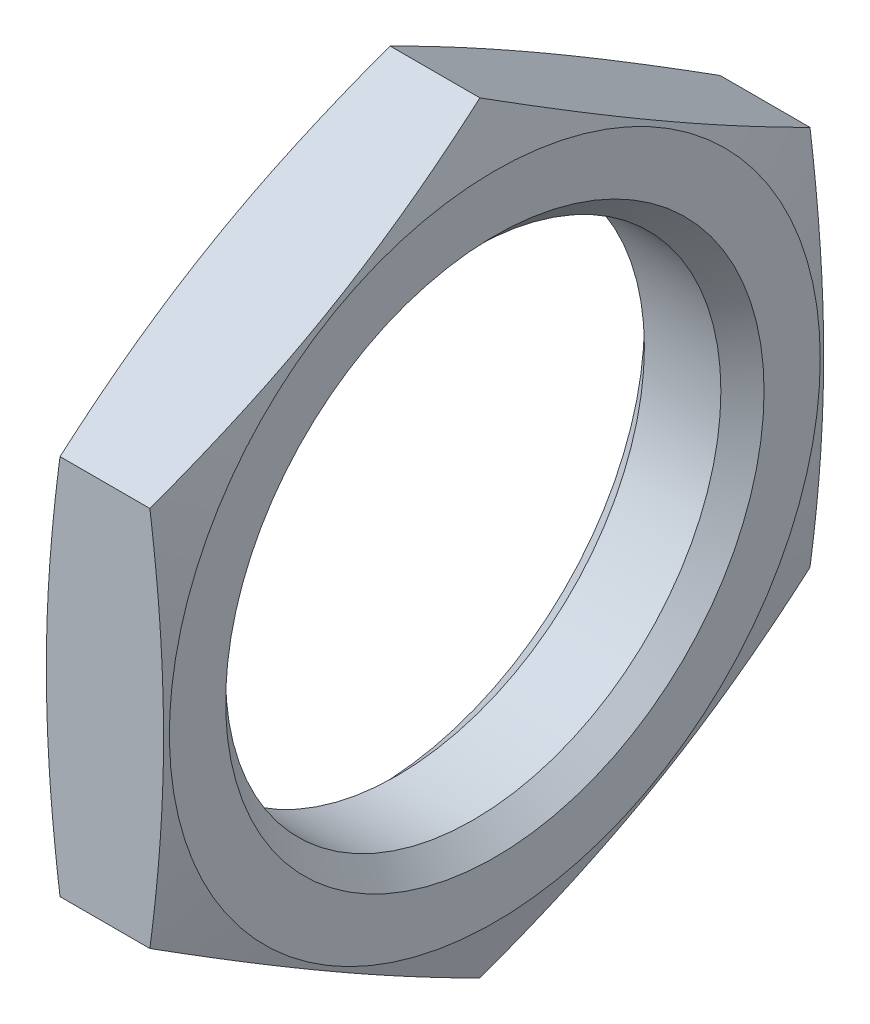
ISO-10303-21;
HEADER;
FILE_DESCRIPTION(('STEP AP214'),'2;1');
FILE_NAME('part.step','',(''),(''),'','','');
FILE_SCHEMA(('AUTOMOTIVE_DESIGN { 1 0 10303 214 1 1 1 1 }'));
ENDSEC;
DATA;
#1=APPLICATION_CONTEXT('core data for automotive mechanical design processes');
#2=APPLICATION_PROTOCOL_DEFINITION('international standard','automotive_design',2000,#1);
#3=PRODUCT_CONTEXT('',#1,'mechanical');
#4=PRODUCT('Part','Part','',(#3));
#5=PRODUCT_RELATED_PRODUCT_CATEGORY('part','',(#4));
#6=PRODUCT_DEFINITION_FORMATION('','',#4);
#7=PRODUCT_DEFINITION_CONTEXT('part definition',#1,'design');
#8=PRODUCT_DEFINITION('design','',#6,#7);
#9=PRODUCT_DEFINITION_SHAPE('','',#8);
#10=(LENGTH_UNIT() NAMED_UNIT(*) SI_UNIT(.MILLI.,.METRE.));
#11=(NAMED_UNIT(*) PLANE_ANGLE_UNIT() SI_UNIT($,.RADIAN.));
#12=(NAMED_UNIT(*) SI_UNIT($,.STERADIAN.) SOLID_ANGLE_UNIT());
#13=UNCERTAINTY_MEASURE_WITH_UNIT(LENGTH_MEASURE(1.E-05),#10,'distance_accuracy_value','');
#14=(GEOMETRIC_REPRESENTATION_CONTEXT(3) GLOBAL_UNCERTAINTY_ASSIGNED_CONTEXT((#13)) GLOBAL_UNIT_ASSIGNED_CONTEXT((#10,
#11,#12)) REPRESENTATION_CONTEXT('',''));
#15=CARTESIAN_POINT('',(0.,0.,0.));
#16=DIRECTION('',(0.,0.,1.));
#17=DIRECTION('',(1.,0.,0.));
#18=AXIS2_PLACEMENT_3D('',#15,#16,#17);
#19=CARTESIAN_POINT('',(-3.175,17.27,0.));
#20=DIRECTION('',(-1.,0.,0.));
#21=DIRECTION('',(0.,0.,1.));
#22=AXIS2_PLACEMENT_3D('',#19,#20,#21);
#23=PLANE('',#22);
#24=CARTESIAN_POINT('',(-3.175,0.,0.));
#25=DIRECTION('',(1.,0.,0.));
#26=DIRECTION('',(0.,0.,-1.));
#27=AXIS2_PLACEMENT_3D('',#24,#25,#26);
#28=CIRCLE('',#27,14.2875);
#29=CARTESIAN_POINT('',(-3.175,0.,-14.2875));
#30=VERTEX_POINT('',#29);
#31=EDGE_CURVE('E375',#30,#30,#28,.T.);
#32=ORIENTED_EDGE('',*,*,#31,.T.);
#33=EDGE_LOOP('',(#32));
#34=FACE_BOUND('',#33,.T.);
#35=CARTESIAN_POINT('',(-3.175,0.,0.));
#36=DIRECTION('',(1.,0.,0.));
#37=DIRECTION('',(0.,0.,-1.));
#38=AXIS2_PLACEMENT_3D('',#35,#36,#37);
#39=CIRCLE('',#38,17.27);
#40=CARTESIAN_POINT('',(-3.175,0.,-17.27));
#41=VERTEX_POINT('',#40);
#42=EDGE_CURVE('E366',#41,#41,#39,.T.);
#43=ORIENTED_EDGE('',*,*,#42,.F.);
#44=EDGE_LOOP('',(#43));
#45=FACE_BOUND('',#44,.T.);
#46=ADVANCED_FACE('F14',(#34,#45),#23,.T.);
#47=CARTESIAN_POINT('',(-3.175,0.,0.));
#48=DIRECTION('',(-1.,0.,0.));
#49=DIRECTION('',(0.,0.,1.));
#50=AXIS2_PLACEMENT_3D('',#47,#48,#49);
#51=CONICAL_SURFACE('',#50,14.2875,0.785398163397448);
#52=CARTESIAN_POINT('',(-2.02946,0.,0.));
#53=DIRECTION('',(1.,0.,0.));
#54=DIRECTION('',(0.,0.,-1.));
#55=AXIS2_PLACEMENT_3D('',#52,#53,#54);
#56=CIRCLE('',#55,13.14196);
#57=CARTESIAN_POINT('',(-2.02946,0.,-13.14196));
#58=VERTEX_POINT('',#57);
#59=EDGE_CURVE('E364',#58,#58,#56,.T.);
#60=ORIENTED_EDGE('',*,*,#59,.T.);
#61=EDGE_LOOP('',(#60));
#62=FACE_BOUND('',#61,.T.);
#63=ORIENTED_EDGE('',*,*,#31,.F.);
#64=EDGE_LOOP('',(#63));
#65=FACE_BOUND('',#64,.T.);
#66=ADVANCED_FACE('F334',(#62,#65),#51,.F.);
#67=CARTESIAN_POINT('',(3.175,0.,0.));
#68=DIRECTION('',(1.,0.,0.));
#69=DIRECTION('',(0.,0.,-1.));
#70=AXIS2_PLACEMENT_3D('',#67,#68,#69);
#71=CYLINDRICAL_SURFACE('',#70,13.14196);
#72=CARTESIAN_POINT('',(2.02946,0.,0.));
#73=DIRECTION('',(1.,0.,0.));
#74=DIRECTION('',(0.,0.,-1.));
#75=AXIS2_PLACEMENT_3D('',#72,#73,#74);
#76=CIRCLE('',#75,13.14196);
#77=CARTESIAN_POINT('',(2.02946,0.,-13.14196));
#78=VERTEX_POINT('',#77);
#79=EDGE_CURVE('E362',#78,#78,#76,.T.);
#80=ORIENTED_EDGE('',*,*,#79,.T.);
#81=EDGE_LOOP('',(#80));
#82=FACE_BOUND('',#81,.T.);
#83=ORIENTED_EDGE('',*,*,#59,.F.);
#84=EDGE_LOOP('',(#83));
#85=FACE_BOUND('',#84,.T.);
#86=ADVANCED_FACE('F341',(#82,#85),#71,.F.);
#87=CARTESIAN_POINT('',(2.02946,0.,0.));
#88=DIRECTION('',(1.,0.,0.));
#89=DIRECTION('',(0.,0.,-1.));
#90=AXIS2_PLACEMENT_3D('',#87,#88,#89);
#91=CONICAL_SURFACE('',#90,13.14196,0.785398163397449);
#92=CARTESIAN_POINT('',(3.175,0.,0.));
#93=DIRECTION('',(1.,0.,0.));
#94=DIRECTION('',(0.,0.,-1.));
#95=AXIS2_PLACEMENT_3D('',#92,#93,#94);
#96=CIRCLE('',#95,14.2875);
#97=CARTESIAN_POINT('',(3.175,0.,-14.2875));
#98=VERTEX_POINT('',#97);
#99=EDGE_CURVE('E356',#98,#98,#96,.T.);
#100=ORIENTED_EDGE('',*,*,#99,.T.);
#101=EDGE_LOOP('',(#100));
#102=FACE_BOUND('',#101,.T.);
#103=ORIENTED_EDGE('',*,*,#79,.F.);
#104=EDGE_LOOP('',(#103));
#105=FACE_BOUND('',#104,.T.);
#106=ADVANCED_FACE('F348',(#102,#105),#91,.F.);
#107=CARTESIAN_POINT('',(3.175,14.2875,0.));
#108=DIRECTION('',(1.,0.,0.));
#109=DIRECTION('',(0.,0.,-1.));
#110=AXIS2_PLACEMENT_3D('',#107,#108,#109);
#111=PLANE('',#110);
#112=CARTESIAN_POINT('',(3.175,0.,0.));
#113=DIRECTION('',(1.,0.,0.));
#114=DIRECTION('',(0.,0.,-1.));
#115=AXIS2_PLACEMENT_3D('',#112,#113,#114);
#116=CIRCLE('',#115,17.27);
#117=CARTESIAN_POINT('',(3.175,0.,-17.27));
#118=VERTEX_POINT('',#117);
#119=EDGE_CURVE('E100',#118,#118,#116,.T.);
#120=ORIENTED_EDGE('',*,*,#119,.T.);
#121=EDGE_LOOP('',(#120));
#122=FACE_BOUND('',#121,.T.);
#123=ORIENTED_EDGE('',*,*,#99,.F.);
#124=EDGE_LOOP('',(#123));
#125=FACE_BOUND('',#124,.T.);
#126=ADVANCED_FACE('F114',(#122,#125),#111,.T.);
#127=CARTESIAN_POINT('',(3.175,0.,0.));
#128=DIRECTION('',(-1.,0.,0.));
#129=DIRECTION('',(0.,0.,1.));
#130=AXIS2_PLACEMENT_3D('',#127,#128,#129);
#131=CONICAL_SURFACE('',#130,17.27,1.30899693899576);
#132=CARTESIAN_POINT('',(2.38332269538683,-10.1122899534625,17.515));
#133=CARTESIAN_POINT('',(2.55223311177848,-8.85152544059453,17.515));
#134=CARTESIAN_POINT('',(2.69769911124534,-7.58948267718227,17.515));
#135=CARTESIAN_POINT('',(2.9284170153407,-5.05305424865949,17.515));
#136=CARTESIAN_POINT('',(3.01309069571983,-3.78305330167152,17.515));
#137=CARTESIAN_POINT('',(3.11001585160665,-1.2292465365758,17.515));
#138=CARTESIAN_POINT('',(3.12192207017828,0.0487220878167653,17.515));
#139=CARTESIAN_POINT('',(3.06958149028336,2.62009229723106,17.515));
#140=CARTESIAN_POINT('',(3.00516805134306,3.91161527311574,17.515));
#141=CARTESIAN_POINT('',(2.84421176827395,6.02162387416869,17.515));
#142=CARTESIAN_POINT('',(2.76773739976261,6.84459038152804,17.515));
#143=CARTESIAN_POINT('',(2.59190830666449,8.48168815980053,17.515));
#144=CARTESIAN_POINT('',(2.49252916295634,9.29716174248899,17.515));
#145=CARTESIAN_POINT('',(2.38332278251315,10.1122893031427,17.515));
#146=B_SPLINE_CURVE_WITH_KNOTS('',3,(#132,#133,#134,#135,#136,#137,#138,#139,#140,#141,#142,
#143,#144,#145),.UNSPECIFIED.,.F.,.F.,(4,2,2,2,2,2,4),(20.5880192356467,24.402684719483,
28.2173502033192,32.0320156871555,35.8466811709918,38.2717200666873,40.6967589623828),.UNSPECIFIED.);
#147=CARTESIAN_POINT('',(2.38332269386039,-10.112289964856,17.515));
#148=VERTEX_POINT('',#147);
#149=CARTESIAN_POINT('',(2.38332269386039,10.112289964856,17.515));
#150=VERTEX_POINT('',#149);
#151=EDGE_CURVE('E72',#148,#150,#146,.T.);
#152=ORIENTED_EDGE('',*,*,#151,.F.);
#153=CARTESIAN_POINT('',(2.38332269385868,-20.2245799297188,-1.00822128423772E-11));
#154=CARTESIAN_POINT('',(2.49600268678897,-19.8040524711068,0.728374924283699));
#155=CARTESIAN_POINT('',(2.59845656627085,-19.3822359643055,1.45898254553474));
#156=CARTESIAN_POINT('',(2.77787623012947,-18.5397547912155,2.91820274174665));
#157=CARTESIAN_POINT('',(2.85491945575485,-18.1188683372808,3.64719946417907));
#158=CARTESIAN_POINT('',(2.98022679949967,-17.276093828032,5.10692773352185));
#159=CARTESIAN_POINT('',(3.02835541984342,-16.8549281562683,5.83640807542046));
#160=CARTESIAN_POINT('',(3.09295603241254,-16.011632130404,7.29703963803822));
#161=CARTESIAN_POINT('',(3.10935244785436,-15.5902062485335,8.02697067706239));
#162=CARTESIAN_POINT('',(3.10935244785437,-14.7466636460355,9.48802932293757));
#163=CARTESIAN_POINT('',(3.09295603241257,-14.325237764165,10.2179603619618));
#164=CARTESIAN_POINT('',(3.02835541984348,-13.4819417383007,11.6785919245795));
#165=CARTESIAN_POINT('',(2.98022679949974,-13.060776066537,12.4080722664782));
#166=CARTESIAN_POINT('',(2.85491945575495,-12.2180015572882,13.8678005358209));
#167=CARTESIAN_POINT('',(2.77787623012958,-11.7971151033535,14.5967972582533));
#168=CARTESIAN_POINT('',(2.59845656627098,-10.9546339302635,16.0560174544652));
#169=CARTESIAN_POINT('',(2.49600268678911,-10.5328174234622,16.7866250757163));
#170=CARTESIAN_POINT('',(2.38332269385883,-10.1122899648502,17.5150000000101));
#171=B_SPLINE_CURVE_WITH_KNOTS('',3,(#153,#154,#155,#156,#157,#158,#159,#160,#161,#162,#163,
#164,#165,#166,#167,#168,#169,#170),.UNSPECIFIED.,.F.,.F.,(4,2,2,2,2,2,2,2,4),
(0.000230940107679989,2.5283034313218,5.05637592253592,7.58444841375004,10.1125209049642,
12.6405933961783,15.1686658873924,17.6967383786065,20.2248108698206),.UNSPECIFIED.);
#172=CARTESIAN_POINT('',(2.38332269386024,-20.224579929713,0.));
#173=VERTEX_POINT('',#172);
#174=EDGE_CURVE('E66',#173,#148,#171,.T.);
#175=ORIENTED_EDGE('',*,*,#174,.F.);
#176=CARTESIAN_POINT('',(2.38332269385883,-10.1122899648502,-17.5150000000101));
#177=CARTESIAN_POINT('',(2.49600268678911,-10.5328174234622,-16.7866250757163));
#178=CARTESIAN_POINT('',(2.59845656627097,-10.9546339302635,-16.0560174544652));
#179=CARTESIAN_POINT('',(2.77787623012957,-11.7971151033535,-14.5967972582533));
#180=CARTESIAN_POINT('',(2.85491945575494,-12.2180015572882,-13.8678005358209));
#181=CARTESIAN_POINT('',(2.98022679949974,-13.060776066537,-12.4080722664782));
#182=CARTESIAN_POINT('',(3.02835541984348,-13.4819417383008,-11.6785919245795));
#183=CARTESIAN_POINT('',(3.09295603241257,-14.325237764165,-10.2179603619618));
#184=CARTESIAN_POINT('',(3.10935244785437,-14.7466636460355,-9.4880293229376));
#185=CARTESIAN_POINT('',(3.10935244785435,-15.5902062485335,-8.02697067706242));
#186=CARTESIAN_POINT('',(3.09295603241254,-16.011632130404,-7.29703963803823));
#187=CARTESIAN_POINT('',(3.02835541984342,-16.8549281562683,-5.83640807542047));
#188=CARTESIAN_POINT('',(2.98022679949967,-17.276093828032,-5.10692773352185));
#189=CARTESIAN_POINT('',(2.85491945575485,-18.1188683372808,-3.64719946417908));
#190=CARTESIAN_POINT('',(2.77787623012947,-18.5397547912155,-2.91820274174667));
#191=CARTESIAN_POINT('',(2.59845656627085,-19.3822359643055,-1.45898254553477));
#192=CARTESIAN_POINT('',(2.49600268678897,-19.8040524711068,-0.728374924283713));
#193=CARTESIAN_POINT('',(2.38332269385868,-20.2245799297188,1.00719343294756E-11));
#194=B_SPLINE_CURVE_WITH_KNOTS('',3,(#176,#177,#178,#179,#180,#181,#182,#183,#184,#185,#186,
#187,#188,#189,#190,#191,#192,#193),.UNSPECIFIED.,.F.,.F.,(4,2,2,2,2,2,2,2,4),
(0.00023094010767577,2.52830343132179,5.05637592253591,7.58444841375003,10.1125209049641,
12.6405933961783,15.1686658873924,17.6967383786065,20.2248108698206),.UNSPECIFIED.);
#195=CARTESIAN_POINT('',(2.38332269386039,-10.112289964856,-17.515));
#196=VERTEX_POINT('',#195);
#197=EDGE_CURVE('E73',#196,#173,#194,.T.);
#198=ORIENTED_EDGE('',*,*,#197,.F.);
#199=CARTESIAN_POINT('',(2.38332269538683,10.1122899534625,-17.515));
#200=CARTESIAN_POINT('',(2.55223311177847,8.85152544059454,-17.515));
#201=CARTESIAN_POINT('',(2.69769911124534,7.58948267718228,-17.515));
#202=CARTESIAN_POINT('',(2.9284170153407,5.05305424865949,-17.515));
#203=CARTESIAN_POINT('',(3.01309069571983,3.78305330167151,-17.515));
#204=CARTESIAN_POINT('',(3.11001585160666,1.22924653657579,-17.515));
#205=CARTESIAN_POINT('',(3.12192207017828,-0.0487220878167636,-17.515));
#206=CARTESIAN_POINT('',(3.06958149028336,-2.62009229723106,-17.515));
#207=CARTESIAN_POINT('',(3.00516805134306,-3.91161527311574,-17.515));
#208=CARTESIAN_POINT('',(2.84421176827395,-6.02162387416869,-17.515));
#209=CARTESIAN_POINT('',(2.76773739976261,-6.84459038152803,-17.515));
#210=CARTESIAN_POINT('',(2.59190830666449,-8.48168815980053,-17.515));
#211=CARTESIAN_POINT('',(2.49252916295634,-9.29716174248901,-17.515));
#212=CARTESIAN_POINT('',(2.38332278251315,-10.1122893031427,-17.515));
#213=B_SPLINE_CURVE_WITH_KNOTS('',3,(#199,#200,#201,#202,#203,#204,#205,#206,#207,#208,#209,
#210,#211,#212),.UNSPECIFIED.,.F.,.F.,(4,2,2,2,2,2,4),(20.5880192356467,24.402684719483,
28.2173502033192,32.0320156871555,35.8466811709918,38.2717200666873,40.6967589623828),.UNSPECIFIED.);
#214=CARTESIAN_POINT('',(2.38332269386039,10.112289964856,-17.515));
#215=VERTEX_POINT('',#214);
#216=EDGE_CURVE('E149',#215,#196,#213,.T.);
#217=ORIENTED_EDGE('',*,*,#216,.F.);
#218=CARTESIAN_POINT('',(2.38332269385868,20.2245799297188,1.00787433954252E-11));
#219=CARTESIAN_POINT('',(2.49600268678897,19.8040524711068,-0.728374924283702));
#220=CARTESIAN_POINT('',(2.59845656627085,19.3822359643055,-1.45898254553475));
#221=CARTESIAN_POINT('',(2.77787623012947,18.5397547912155,-2.91820274174666));
#222=CARTESIAN_POINT('',(2.85491945575485,18.1188683372808,-3.64719946417906));
#223=CARTESIAN_POINT('',(2.98022679949967,17.276093828032,-5.10692773352184));
#224=CARTESIAN_POINT('',(3.02835541984342,16.8549281562683,-5.83640807542045));
#225=CARTESIAN_POINT('',(3.09295603241254,16.011632130404,-7.29703963803823));
#226=CARTESIAN_POINT('',(3.10935244785436,15.5902062485335,-8.02697067706241));
#227=CARTESIAN_POINT('',(3.10935244785437,14.7466636460355,-9.48802932293759));
#228=CARTESIAN_POINT('',(3.09295603241257,14.325237764165,-10.2179603619618));
#229=CARTESIAN_POINT('',(3.02835541984348,13.4819417383007,-11.6785919245795));
#230=CARTESIAN_POINT('',(2.98022679949974,13.060776066537,-12.4080722664782));
#231=CARTESIAN_POINT('',(2.85491945575495,12.2180015572882,-13.8678005358209));
#232=CARTESIAN_POINT('',(2.77787623012957,11.7971151033535,-14.5967972582533));
#233=CARTESIAN_POINT('',(2.59845656627098,10.9546339302635,-16.0560174544652));
#234=CARTESIAN_POINT('',(2.49600268678911,10.5328174234622,-16.7866250757163));
#235=CARTESIAN_POINT('',(2.38332269385883,10.1122899648502,-17.5150000000101));
#236=B_SPLINE_CURVE_WITH_KNOTS('',3,(#218,#219,#220,#221,#222,#223,#224,#225,#226,#227,#228,
#229,#230,#231,#232,#233,#234,#235),.UNSPECIFIED.,.F.,.F.,(4,2,2,2,2,2,2,2,4),
(0.000230940107679767,2.5283034313218,5.05637592253592,7.58444841375004,10.1125209049642,
12.6405933961783,15.1686658873924,17.6967383786065,20.2248108698206),.UNSPECIFIED.);
#237=CARTESIAN_POINT('',(2.38332269386024,20.224579929713,0.));
#238=VERTEX_POINT('',#237);
#239=EDGE_CURVE('E146',#238,#215,#236,.T.);
#240=ORIENTED_EDGE('',*,*,#239,.F.);
#241=CARTESIAN_POINT('',(2.38332269385882,10.1122899648502,17.5150000000101));
#242=CARTESIAN_POINT('',(2.49600268678911,10.5328174234622,16.7866250757163));
#243=CARTESIAN_POINT('',(2.59845656627097,10.9546339302635,16.0560174544652));
#244=CARTESIAN_POINT('',(2.77787623012957,11.7971151033535,14.5967972582533));
#245=CARTESIAN_POINT('',(2.85491945575494,12.2180015572882,13.8678005358209));
#246=CARTESIAN_POINT('',(2.98022679949974,13.060776066537,12.4080722664782));
#247=CARTESIAN_POINT('',(3.02835541984348,13.4819417383008,11.6785919245795));
#248=CARTESIAN_POINT('',(3.09295603241257,14.325237764165,10.2179603619618));
#249=CARTESIAN_POINT('',(3.10935244785437,14.7466636460355,9.48802932293759));
#250=CARTESIAN_POINT('',(3.10935244785436,15.5902062485335,8.02697067706241));
#251=CARTESIAN_POINT('',(3.09295603241254,16.011632130404,7.29703963803823));
#252=CARTESIAN_POINT('',(3.02835541984342,16.8549281562683,5.83640807542046));
#253=CARTESIAN_POINT('',(2.98022679949967,17.276093828032,5.10692773352184));
#254=CARTESIAN_POINT('',(2.85491945575485,18.1188683372808,3.64719946417907));
#255=CARTESIAN_POINT('',(2.77787623012946,18.5397547912156,2.91820274174666));
#256=CARTESIAN_POINT('',(2.59845656627084,19.3822359643055,1.45898254553476));
#257=CARTESIAN_POINT('',(2.49600268678897,19.8040524711068,0.728374924283715));
#258=CARTESIAN_POINT('',(2.38332269385868,20.2245799297188,-1.00636877195707E-11));
#259=B_SPLINE_CURVE_WITH_KNOTS('',3,(#241,#242,#243,#244,#245,#246,#247,#248,#249,#250,#251,
#252,#253,#254,#255,#256,#257,#258),.UNSPECIFIED.,.F.,.F.,(4,2,2,2,2,2,2,2,4),
(0.00023094010767577,2.52830343132179,5.05637592253591,7.58444841375003,10.1125209049641,
12.6405933961783,15.1686658873924,17.6967383786065,20.2248108698206),.UNSPECIFIED.);
#260=EDGE_CURVE('E94',#150,#238,#259,.T.);
#261=ORIENTED_EDGE('',*,*,#260,.F.);
#262=EDGE_LOOP('',(#152,#175,#198,#217,#240,#261));
#263=FACE_BOUND('',#262,.T.);
#264=ORIENTED_EDGE('',*,*,#119,.F.);
#265=EDGE_LOOP('',(#264));
#266=FACE_BOUND('',#265,.T.);
#267=ADVANCED_FACE('F93',(#263,#266),#131,.T.);
#268=CARTESIAN_POINT('',(-2.1707264267682,0.,0.));
#269=DIRECTION('',(1.,0.,0.));
#270=DIRECTION('',(0.,0.,-1.));
#271=AXIS2_PLACEMENT_3D('',#268,#269,#270);
#272=CONICAL_SURFACE('',#271,21.018,1.30899693899576);
#273=CARTESIAN_POINT('',(-2.38332269538682,10.1122899534625,17.515));
#274=CARTESIAN_POINT('',(-2.55223311177847,8.85152544059454,17.515));
#275=CARTESIAN_POINT('',(-2.69769911124533,7.58948267718228,17.515));
#276=CARTESIAN_POINT('',(-2.9284170153407,5.0530542486595,17.515));
#277=CARTESIAN_POINT('',(-3.01309069571983,3.78305330167152,17.515));
#278=CARTESIAN_POINT('',(-3.11001585160665,1.2292465365758,17.515));
#279=CARTESIAN_POINT('',(-3.12192207017828,-0.0487220878167618,17.515));
#280=CARTESIAN_POINT('',(-3.06958149028336,-2.62009229723106,17.515));
#281=CARTESIAN_POINT('',(-3.00516805134306,-3.91161527311573,17.515));
#282=CARTESIAN_POINT('',(-2.84421176827395,-6.02162387416869,17.515));
#283=CARTESIAN_POINT('',(-2.76773739976261,-6.84459038152804,17.515));
#284=CARTESIAN_POINT('',(-2.59190830666449,-8.48168815980053,17.515));
#285=CARTESIAN_POINT('',(-2.49252916295633,-9.297161742489,17.515));
#286=CARTESIAN_POINT('',(-2.38332278251315,-10.1122893031427,17.515));
#287=B_SPLINE_CURVE_WITH_KNOTS('',3,(#273,#274,#275,#276,#277,#278,#279,#280,#281,#282,#283,
#284,#285,#286),.UNSPECIFIED.,.F.,.F.,(4,2,2,2,2,2,4),(20.5880192356467,24.402684719483,
28.2173502033192,32.0320156871555,35.8466811709918,38.2717200666873,40.6967589623828),.UNSPECIFIED.);
#288=CARTESIAN_POINT('',(-2.38332269386039,10.112289964856,17.515));
#289=VERTEX_POINT('',#288);
#290=CARTESIAN_POINT('',(-2.38332269386039,-10.112289964856,17.515));
#291=VERTEX_POINT('',#290);
#292=EDGE_CURVE('E83',#289,#291,#287,.T.);
#293=ORIENTED_EDGE('',*,*,#292,.F.);
#294=CARTESIAN_POINT('',(-2.38332269385868,20.2245799297188,-1.00704517563956E-11));
#295=CARTESIAN_POINT('',(-2.49600268678897,19.8040524711068,0.728374924283712));
#296=CARTESIAN_POINT('',(-2.59845656627085,19.3822359643055,1.45898254553476));
#297=CARTESIAN_POINT('',(-2.77787623012946,18.5397547912155,2.91820274174667));
#298=CARTESIAN_POINT('',(-2.85491945575485,18.1188683372808,3.64719946417907));
#299=CARTESIAN_POINT('',(-2.98022679949967,17.276093828032,5.10692773352184));
#300=CARTESIAN_POINT('',(-3.02835541984342,16.8549281562683,5.83640807542046));
#301=CARTESIAN_POINT('',(-3.09295603241254,16.011632130404,7.29703963803823));
#302=CARTESIAN_POINT('',(-3.10935244785436,15.5902062485335,8.02697067706241));
#303=CARTESIAN_POINT('',(-3.10935244785437,14.7466636460355,9.4880293229376));
#304=CARTESIAN_POINT('',(-3.09295603241257,14.325237764165,10.2179603619618));
#305=CARTESIAN_POINT('',(-3.02835541984348,13.4819417383008,11.6785919245795));
#306=CARTESIAN_POINT('',(-2.98022679949974,13.060776066537,12.4080722664782));
#307=CARTESIAN_POINT('',(-2.85491945575494,12.2180015572882,13.8678005358209));
#308=CARTESIAN_POINT('',(-2.77787623012958,11.7971151033535,14.5967972582533));
#309=CARTESIAN_POINT('',(-2.59845656627098,10.9546339302635,16.0560174544652));
#310=CARTESIAN_POINT('',(-2.49600268678911,10.5328174234622,16.7866250757163));
#311=CARTESIAN_POINT('',(-2.38332269385883,10.1122899648502,17.5150000000101));
#312=B_SPLINE_CURVE_WITH_KNOTS('',3,(#294,#295,#296,#297,#298,#299,#300,#301,#302,#303,#304,
#305,#306,#307,#308,#309,#310,#311),.UNSPECIFIED.,.F.,.F.,(4,2,2,2,2,2,2,2,4),
(0.000230940107679767,2.5283034313218,5.05637592253592,7.58444841375004,10.1125209049642,
12.6405933961783,15.1686658873924,17.6967383786065,20.2248108698206),.UNSPECIFIED.);
#313=CARTESIAN_POINT('',(-2.38332269386024,20.224579929713,0.));
#314=VERTEX_POINT('',#313);
#315=EDGE_CURVE('E311',#314,#289,#312,.T.);
#316=ORIENTED_EDGE('',*,*,#315,.F.);
#317=CARTESIAN_POINT('',(-2.38332269385883,10.1122899648502,-17.5150000000101));
#318=CARTESIAN_POINT('',(-2.49600268678911,10.5328174234622,-16.7866250757163));
#319=CARTESIAN_POINT('',(-2.59845656627098,10.9546339302635,-16.0560174544652));
#320=CARTESIAN_POINT('',(-2.77787623012958,11.7971151033535,-14.5967972582533));
#321=CARTESIAN_POINT('',(-2.85491945575495,12.2180015572882,-13.8678005358209));
#322=CARTESIAN_POINT('',(-2.98022679949974,13.060776066537,-12.4080722664782));
#323=CARTESIAN_POINT('',(-3.02835541984348,13.4819417383007,-11.6785919245795));
#324=CARTESIAN_POINT('',(-3.09295603241257,14.325237764165,-10.2179603619618));
#325=CARTESIAN_POINT('',(-3.10935244785437,14.7466636460355,-9.48802932293758));
#326=CARTESIAN_POINT('',(-3.10935244785436,15.5902062485335,-8.0269706770624));
#327=CARTESIAN_POINT('',(-3.09295603241254,16.011632130404,-7.29703963803822));
#328=CARTESIAN_POINT('',(-3.02835541984342,16.8549281562683,-5.83640807542045));
#329=CARTESIAN_POINT('',(-2.98022679949967,17.276093828032,-5.10692773352184));
#330=CARTESIAN_POINT('',(-2.85491945575485,18.1188683372808,-3.64719946417906));
#331=CARTESIAN_POINT('',(-2.77787623012947,18.5397547912155,-2.91820274174665));
#332=CARTESIAN_POINT('',(-2.59845656627085,19.3822359643055,-1.45898254553474));
#333=CARTESIAN_POINT('',(-2.49600268678898,19.8040524711068,-0.728374924283702));
#334=CARTESIAN_POINT('',(-2.38332269385868,20.2245799297188,1.00752739484733E-11));
#335=B_SPLINE_CURVE_WITH_KNOTS('',3,(#317,#318,#319,#320,#321,#322,#323,#324,#325,#326,#327,
#328,#329,#330,#331,#332,#333,#334),.UNSPECIFIED.,.F.,.F.,(4,2,2,2,2,2,2,2,4),
(0.00023094010767577,2.52830343132179,5.05637592253591,7.58444841375003,10.1125209049641,
12.6405933961783,15.1686658873924,17.6967383786065,20.2248108698206),.UNSPECIFIED.);
#336=CARTESIAN_POINT('',(-2.38332269386039,10.112289964856,-17.515));
#337=VERTEX_POINT('',#336);
#338=EDGE_CURVE('E246',#337,#314,#335,.T.);
#339=ORIENTED_EDGE('',*,*,#338,.F.);
#340=CARTESIAN_POINT('',(-2.38332269538682,-10.1122899534625,-17.515));
#341=CARTESIAN_POINT('',(-2.55223311177847,-8.85152544059453,-17.515));
#342=CARTESIAN_POINT('',(-2.69769911124534,-7.58948267718228,-17.515));
#343=CARTESIAN_POINT('',(-2.92841701534069,-5.05305424865949,-17.515));
#344=CARTESIAN_POINT('',(-3.01309069571983,-3.78305330167151,-17.515));
#345=CARTESIAN_POINT('',(-3.11001585160665,-1.22924653657578,-17.515));
#346=CARTESIAN_POINT('',(-3.12192207017828,0.0487220878167775,-17.515));
#347=CARTESIAN_POINT('',(-3.06958149028336,2.62009229723107,-17.515));
#348=CARTESIAN_POINT('',(-3.00516805134306,3.91161527311574,-17.515));
#349=CARTESIAN_POINT('',(-2.84421176827395,6.02162387416869,-17.515));
#350=CARTESIAN_POINT('',(-2.76773739976261,6.84459038152803,-17.515));
#351=CARTESIAN_POINT('',(-2.59190830666449,8.48168815980051,-17.515));
#352=CARTESIAN_POINT('',(-2.49252916295634,9.29716174248899,-17.515));
#353=CARTESIAN_POINT('',(-2.38332278251315,10.1122893031427,-17.515));
#354=B_SPLINE_CURVE_WITH_KNOTS('',3,(#340,#341,#342,#343,#344,#345,#346,#347,#348,#349,#350,
#351,#352,#353),.UNSPECIFIED.,.F.,.F.,(4,2,2,2,2,2,4),(20.5880192356467,24.402684719483,
28.2173502033193,32.0320156871555,35.8466811709918,38.2717200666873,40.6967589623828),.UNSPECIFIED.);
#355=CARTESIAN_POINT('',(-2.38332269386039,-10.112289964856,-17.515));
#356=VERTEX_POINT('',#355);
#357=EDGE_CURVE('E209',#356,#337,#354,.T.);
#358=ORIENTED_EDGE('',*,*,#357,.F.);
#359=CARTESIAN_POINT('',(-2.38332269385868,-20.2245799297188,1.00790454922166E-11));
#360=CARTESIAN_POINT('',(-2.49600268678897,-19.8040524711068,-0.728374924283707));
#361=CARTESIAN_POINT('',(-2.59845656627085,-19.3822359643055,-1.45898254553476));
#362=CARTESIAN_POINT('',(-2.77787623012947,-18.5397547912155,-2.91820274174667));
#363=CARTESIAN_POINT('',(-2.85491945575485,-18.1188683372808,-3.64719946417906));
#364=CARTESIAN_POINT('',(-2.98022679949967,-17.276093828032,-5.10692773352183));
#365=CARTESIAN_POINT('',(-3.02835541984342,-16.8549281562683,-5.83640807542046));
#366=CARTESIAN_POINT('',(-3.09295603241254,-16.011632130404,-7.29703963803823));
#367=CARTESIAN_POINT('',(-3.10935244785436,-15.5902062485335,-8.0269706770624));
#368=CARTESIAN_POINT('',(-3.10935244785437,-14.7466636460356,-9.48802932293758));
#369=CARTESIAN_POINT('',(-3.09295603241257,-14.3252377641651,-10.2179603619618));
#370=CARTESIAN_POINT('',(-3.02835541984348,-13.4819417383008,-11.6785919245795));
#371=CARTESIAN_POINT('',(-2.98022679949974,-13.060776066537,-12.4080722664782));
#372=CARTESIAN_POINT('',(-2.85491945575495,-12.2180015572882,-13.8678005358209));
#373=CARTESIAN_POINT('',(-2.77787623012958,-11.7971151033535,-14.5967972582533));
#374=CARTESIAN_POINT('',(-2.59845656627098,-10.9546339302635,-16.0560174544652));
#375=CARTESIAN_POINT('',(-2.49600268678911,-10.5328174234622,-16.7866250757163));
#376=CARTESIAN_POINT('',(-2.38332269385882,-10.1122899648502,-17.5150000000101));
#377=B_SPLINE_CURVE_WITH_KNOTS('',3,(#359,#360,#361,#362,#363,#364,#365,#366,#367,#368,#369,
#370,#371,#372,#373,#374,#375,#376),.UNSPECIFIED.,.F.,.F.,(4,2,2,2,2,2,2,2,4),
(0.000230940107679767,2.5283034313218,5.05637592253592,7.58444841375004,10.1125209049642,
12.6405933961783,15.1686658873924,17.6967383786065,20.2248108698206),.UNSPECIFIED.);
#378=CARTESIAN_POINT('',(-2.38332269386024,-20.224579929713,0.));
#379=VERTEX_POINT('',#378);
#380=EDGE_CURVE('E236',#379,#356,#377,.T.);
#381=ORIENTED_EDGE('',*,*,#380,.F.);
#382=CARTESIAN_POINT('',(-2.38332269385883,-10.1122899648502,17.5150000000101));
#383=CARTESIAN_POINT('',(-2.49600268678911,-10.5328174234622,16.7866250757163));
#384=CARTESIAN_POINT('',(-2.59845656627098,-10.9546339302635,16.0560174544652));
#385=CARTESIAN_POINT('',(-2.77787623012958,-11.7971151033535,14.5967972582533));
#386=CARTESIAN_POINT('',(-2.85491945575495,-12.2180015572882,13.8678005358209));
#387=CARTESIAN_POINT('',(-2.98022679949974,-13.060776066537,12.4080722664782));
#388=CARTESIAN_POINT('',(-3.02835541984348,-13.4819417383007,11.6785919245795));
#389=CARTESIAN_POINT('',(-3.09295603241257,-14.325237764165,10.2179603619618));
#390=CARTESIAN_POINT('',(-3.10935244785437,-14.7466636460355,9.48802932293758));
#391=CARTESIAN_POINT('',(-3.10935244785436,-15.5902062485335,8.0269706770624));
#392=CARTESIAN_POINT('',(-3.09295603241254,-16.011632130404,7.29703963803823));
#393=CARTESIAN_POINT('',(-3.02835541984342,-16.8549281562683,5.83640807542046));
#394=CARTESIAN_POINT('',(-2.98022679949967,-17.276093828032,5.10692773352185));
#395=CARTESIAN_POINT('',(-2.85491945575485,-18.1188683372808,3.64719946417907));
#396=CARTESIAN_POINT('',(-2.77787623012947,-18.5397547912155,2.91820274174666));
#397=CARTESIAN_POINT('',(-2.59845656627085,-19.3822359643055,1.45898254553475));
#398=CARTESIAN_POINT('',(-2.49600268678898,-19.8040524711068,0.728374924283702));
#399=CARTESIAN_POINT('',(-2.38332269385868,-20.2245799297188,-1.00752739484733E-11));
#400=B_SPLINE_CURVE_WITH_KNOTS('',3,(#382,#383,#384,#385,#386,#387,#388,#389,#390,#391,#392,
#393,#394,#395,#396,#397,#398,#399),.UNSPECIFIED.,.F.,.F.,(4,2,2,2,2,2,2,2,4),
(0.00023094010767577,2.52830343132179,5.05637592253591,7.58444841375003,10.1125209049641,
12.6405933961783,15.1686658873924,17.6967383786065,20.2248108698206),.UNSPECIFIED.);
#401=EDGE_CURVE('E40',#291,#379,#400,.T.);
#402=ORIENTED_EDGE('',*,*,#401,.F.);
#403=EDGE_LOOP('',(#293,#316,#339,#358,#381,#402));
#404=FACE_BOUND('',#403,.T.);
#405=ORIENTED_EDGE('',*,*,#42,.T.);
#406=EDGE_LOOP('',(#405));
#407=FACE_BOUND('',#406,.T.);
#408=ADVANCED_FACE('F113',(#404,#407),#272,.T.);
#409=CARTESIAN_POINT('',(6.35,10.112289964856,17.515));
#410=DIRECTION('',(0.,0.,-1.));
#411=DIRECTION('',(-1.,0.,0.));
#412=AXIS2_PLACEMENT_3D('',#409,#410,#411);
#413=PLANE('',#412);
#414=ORIENTED_EDGE('',*,*,#151,.T.);
#415=DIRECTION('',(-1.,0.,0.));
#416=VECTOR('',#415,1.);
#417=CARTESIAN_POINT('',(2.38332269386039,10.112289964856,17.515));
#418=LINE('',#417,#416);
#419=EDGE_CURVE('E89',#150,#289,#418,.T.);
#420=ORIENTED_EDGE('',*,*,#419,.T.);
#421=ORIENTED_EDGE('',*,*,#292,.T.);
#422=DIRECTION('',(-1.,0.,0.));
#423=VECTOR('',#422,1.);
#424=CARTESIAN_POINT('',(2.38332269386039,-10.112289964856,17.515));
#425=LINE('',#424,#423);
#426=EDGE_CURVE('E31',#148,#291,#425,.T.);
#427=ORIENTED_EDGE('',*,*,#426,.F.);
#428=EDGE_LOOP('',(#414,#420,#421,#427));
#429=FACE_BOUND('',#428,.T.);
#430=ADVANCED_FACE('F78',(#429),#413,.F.);
#431=CARTESIAN_POINT('',(6.35,20.224579929713,0.));
#432=DIRECTION('',(0.,-0.866025403784424,-0.500000000000026));
#433=DIRECTION('',(0.,0.500000000000026,-0.866025403784424));
#434=AXIS2_PLACEMENT_3D('',#431,#432,#433);
#435=PLANE('',#434);
#436=ORIENTED_EDGE('',*,*,#260,.T.);
#437=DIRECTION('',(-1.,0.,0.));
#438=VECTOR('',#437,1.);
#439=CARTESIAN_POINT('',(2.38332269386024,20.224579929713,0.));
#440=LINE('',#439,#438);
#441=EDGE_CURVE('E87',#238,#314,#440,.T.);
#442=ORIENTED_EDGE('',*,*,#441,.T.);
#443=ORIENTED_EDGE('',*,*,#315,.T.);
#444=ORIENTED_EDGE('',*,*,#419,.F.);
#445=EDGE_LOOP('',(#436,#442,#443,#444));
#446=FACE_BOUND('',#445,.T.);
#447=ADVANCED_FACE('F178',(#446),#435,.F.);
#448=CARTESIAN_POINT('',(6.35,10.112289964856,-17.515));
#449=DIRECTION('',(0.,-0.866025403784424,0.500000000000026));
#450=DIRECTION('',(0.,-0.500000000000026,-0.866025403784424));
#451=AXIS2_PLACEMENT_3D('',#448,#449,#450);
#452=PLANE('',#451);
#453=ORIENTED_EDGE('',*,*,#239,.T.);
#454=DIRECTION('',(-1.,0.,0.));
#455=VECTOR('',#454,1.);
#456=CARTESIAN_POINT('',(2.38332269386039,10.112289964856,-17.515));
#457=LINE('',#456,#455);
#458=EDGE_CURVE('E160',#215,#337,#457,.T.);
#459=ORIENTED_EDGE('',*,*,#458,.T.);
#460=ORIENTED_EDGE('',*,*,#338,.T.);
#461=ORIENTED_EDGE('',*,*,#441,.F.);
#462=EDGE_LOOP('',(#453,#459,#460,#461));
#463=FACE_BOUND('',#462,.T.);
#464=ADVANCED_FACE('F158',(#463),#452,.F.);
#465=CARTESIAN_POINT('',(6.35,-10.112289964856,-17.515));
#466=DIRECTION('',(0.,0.,1.));
#467=DIRECTION('',(1.,0.,0.));
#468=AXIS2_PLACEMENT_3D('',#465,#466,#467);
#469=PLANE('',#468);
#470=ORIENTED_EDGE('',*,*,#216,.T.);
#471=DIRECTION('',(-1.,0.,0.));
#472=VECTOR('',#471,1.);
#473=CARTESIAN_POINT('',(2.38332269386039,-10.112289964856,-17.515));
#474=LINE('',#473,#472);
#475=EDGE_CURVE('E25',#196,#356,#474,.T.);
#476=ORIENTED_EDGE('',*,*,#475,.T.);
#477=ORIENTED_EDGE('',*,*,#357,.T.);
#478=ORIENTED_EDGE('',*,*,#458,.F.);
#479=EDGE_LOOP('',(#470,#476,#477,#478));
#480=FACE_BOUND('',#479,.T.);
#481=ADVANCED_FACE('F176',(#480),#469,.F.);
#482=CARTESIAN_POINT('',(6.35,-20.224579929713,0.));
#483=DIRECTION('',(0.,0.866025403784424,0.500000000000026));
#484=DIRECTION('',(0.,-0.500000000000026,0.866025403784424));
#485=AXIS2_PLACEMENT_3D('',#482,#483,#484);
#486=PLANE('',#485);
#487=ORIENTED_EDGE('',*,*,#197,.T.);
#488=DIRECTION('',(-1.,0.,0.));
#489=VECTOR('',#488,1.);
#490=CARTESIAN_POINT('',(2.38332269386024,-20.224579929713,0.));
#491=LINE('',#490,#489);
#492=EDGE_CURVE('E9',#173,#379,#491,.T.);
#493=ORIENTED_EDGE('',*,*,#492,.T.);
#494=ORIENTED_EDGE('',*,*,#380,.T.);
#495=ORIENTED_EDGE('',*,*,#475,.F.);
#496=EDGE_LOOP('',(#487,#493,#494,#495));
#497=FACE_BOUND('',#496,.T.);
#498=ADVANCED_FACE('F221',(#497),#486,.F.);
#499=CARTESIAN_POINT('',(6.35,-10.112289964856,17.515));
#500=DIRECTION('',(0.,0.866025403784424,-0.500000000000026));
#501=DIRECTION('',(0.,0.500000000000026,0.866025403784424));
#502=AXIS2_PLACEMENT_3D('',#499,#500,#501);
#503=PLANE('',#502);
#504=ORIENTED_EDGE('',*,*,#174,.T.);
#505=ORIENTED_EDGE('',*,*,#426,.T.);
#506=ORIENTED_EDGE('',*,*,#401,.T.);
#507=ORIENTED_EDGE('',*,*,#492,.F.);
#508=EDGE_LOOP('',(#504,#505,#506,#507));
#509=FACE_BOUND('',#508,.T.);
#510=ADVANCED_FACE('F16',(#509),#503,.F.);
#511=CLOSED_SHELL('',(#46,#66,#86,#106,#126,#267,#408,#430,#447,#464,#481,#498,#510));
#512=MANIFOLD_SOLID_BREP('B1',#511);
#513=ADVANCED_BREP_SHAPE_REPRESENTATION('',(#18,#512),#14);
#514=SHAPE_DEFINITION_REPRESENTATION(#9,#513);
ENDSEC;
END-ISO-10303-21;
